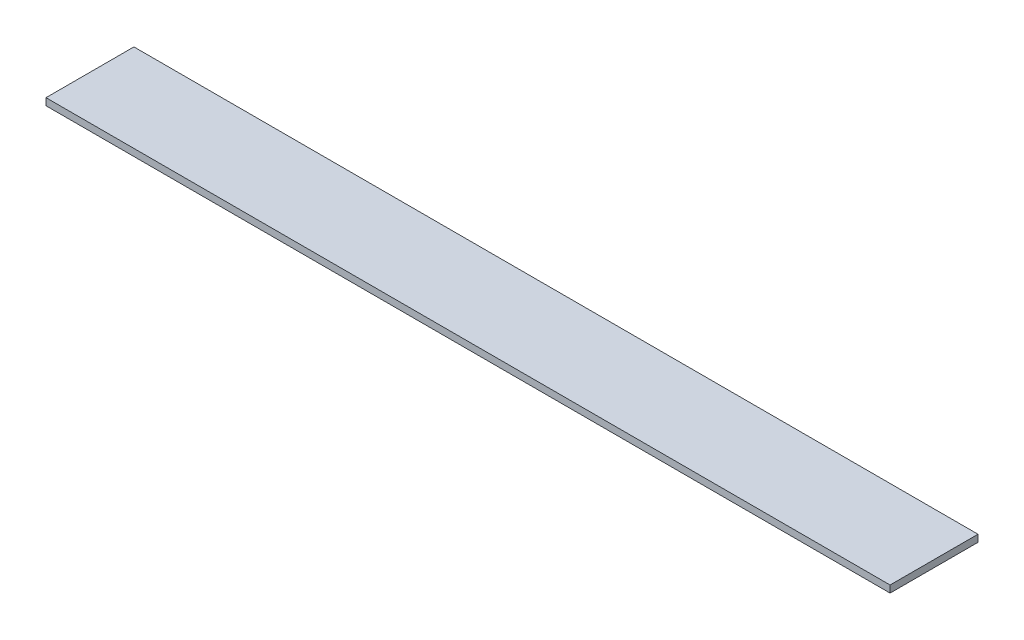
ISO-10303-21;
HEADER;
FILE_DESCRIPTION(('STEP AP214'),'2;1');
FILE_NAME('part.step','',(''),(''),'','','');
FILE_SCHEMA(('AUTOMOTIVE_DESIGN { 1 0 10303 214 1 1 1 1 }'));
ENDSEC;
DATA;
#1=APPLICATION_CONTEXT('core data for automotive mechanical design processes');
#2=APPLICATION_PROTOCOL_DEFINITION('international standard','automotive_design',2000,#1);
#3=PRODUCT_CONTEXT('',#1,'mechanical');
#4=PRODUCT('Part','Part','',(#3));
#5=PRODUCT_RELATED_PRODUCT_CATEGORY('part','',(#4));
#6=PRODUCT_DEFINITION_FORMATION('','',#4);
#7=PRODUCT_DEFINITION_CONTEXT('part definition',#1,'design');
#8=PRODUCT_DEFINITION('design','',#6,#7);
#9=PRODUCT_DEFINITION_SHAPE('','',#8);
#10=(LENGTH_UNIT() NAMED_UNIT(*) SI_UNIT(.MILLI.,.METRE.));
#11=(NAMED_UNIT(*) PLANE_ANGLE_UNIT() SI_UNIT($,.RADIAN.));
#12=(NAMED_UNIT(*) SI_UNIT($,.STERADIAN.) SOLID_ANGLE_UNIT());
#13=UNCERTAINTY_MEASURE_WITH_UNIT(LENGTH_MEASURE(1.E-05),#10,'distance_accuracy_value','');
#14=(GEOMETRIC_REPRESENTATION_CONTEXT(3) GLOBAL_UNCERTAINTY_ASSIGNED_CONTEXT((#13)) GLOBAL_UNIT_ASSIGNED_CONTEXT((#10,
#11,#12)) REPRESENTATION_CONTEXT('',''));
#15=CARTESIAN_POINT('',(0.,0.,0.));
#16=DIRECTION('',(0.,0.,1.));
#17=DIRECTION('',(1.,0.,0.));
#18=AXIS2_PLACEMENT_3D('',#15,#16,#17);
#19=CARTESIAN_POINT('',(304.8,2.54,0.));
#20=DIRECTION('',(0.,0.,-1.));
#21=DIRECTION('',(-1.,0.,0.));
#22=AXIS2_PLACEMENT_3D('',#19,#20,#21);
#23=PLANE('',#22);
#24=DIRECTION('',(1.,0.,0.));
#25=VECTOR('',#24,1.);
#26=CARTESIAN_POINT('',(304.8,0.,0.));
#27=LINE('',#26,#25);
#28=CARTESIAN_POINT('',(0.,0.,0.));
#29=VERTEX_POINT('',#28);
#30=CARTESIAN_POINT('',(304.8,0.,0.));
#31=VERTEX_POINT('',#30);
#32=EDGE_CURVE('E96',#29,#31,#27,.T.);
#33=ORIENTED_EDGE('',*,*,#32,.T.);
#34=DIRECTION('',(0.,-1.,0.));
#35=VECTOR('',#34,1.);
#36=CARTESIAN_POINT('',(304.8,2.54,0.));
#37=LINE('',#36,#35);
#38=CARTESIAN_POINT('',(304.8,2.54,0.));
#39=VERTEX_POINT('',#38);
#40=EDGE_CURVE('E11',#39,#31,#37,.T.);
#41=ORIENTED_EDGE('',*,*,#40,.F.);
#42=DIRECTION('',(1.,0.,0.));
#43=VECTOR('',#42,1.);
#44=CARTESIAN_POINT('',(304.8,2.54,0.));
#45=LINE('',#44,#43);
#46=CARTESIAN_POINT('',(0.,2.54,0.));
#47=VERTEX_POINT('',#46);
#48=EDGE_CURVE('E84',#47,#39,#45,.T.);
#49=ORIENTED_EDGE('',*,*,#48,.F.);
#50=DIRECTION('',(0.,-1.,0.));
#51=VECTOR('',#50,1.);
#52=CARTESIAN_POINT('',(0.,2.54,0.));
#53=LINE('',#52,#51);
#54=EDGE_CURVE('E92',#47,#29,#53,.T.);
#55=ORIENTED_EDGE('',*,*,#54,.T.);
#56=EDGE_LOOP('',(#33,#41,#49,#55));
#57=FACE_BOUND('',#56,.T.);
#58=ADVANCED_FACE('F33',(#57),#23,.F.);
#59=CARTESIAN_POINT('',(304.8,2.54,-31.75));
#60=DIRECTION('',(-1.,0.,0.));
#61=DIRECTION('',(0.,0.,1.));
#62=AXIS2_PLACEMENT_3D('',#59,#60,#61);
#63=PLANE('',#62);
#64=DIRECTION('',(0.,0.,-1.));
#65=VECTOR('',#64,1.);
#66=CARTESIAN_POINT('',(304.8,0.,-31.75));
#67=LINE('',#66,#65);
#68=CARTESIAN_POINT('',(304.8,0.,-31.75));
#69=VERTEX_POINT('',#68);
#70=EDGE_CURVE('E88',#31,#69,#67,.T.);
#71=ORIENTED_EDGE('',*,*,#70,.T.);
#72=DIRECTION('',(0.,-1.,0.));
#73=VECTOR('',#72,1.);
#74=CARTESIAN_POINT('',(304.8,2.54,-31.75));
#75=LINE('',#74,#73);
#76=CARTESIAN_POINT('',(304.8,2.54,-31.75));
#77=VERTEX_POINT('',#76);
#78=EDGE_CURVE('E41',#77,#69,#75,.T.);
#79=ORIENTED_EDGE('',*,*,#78,.F.);
#80=DIRECTION('',(0.,0.,-1.));
#81=VECTOR('',#80,1.);
#82=CARTESIAN_POINT('',(304.8,2.54,-31.75));
#83=LINE('',#82,#81);
#84=EDGE_CURVE('E79',#39,#77,#83,.T.);
#85=ORIENTED_EDGE('',*,*,#84,.F.);
#86=ORIENTED_EDGE('',*,*,#40,.T.);
#87=EDGE_LOOP('',(#71,#79,#85,#86));
#88=FACE_BOUND('',#87,.T.);
#89=ADVANCED_FACE('F87',(#88),#63,.F.);
#90=CARTESIAN_POINT('',(0.,2.54,-31.75));
#91=DIRECTION('',(0.,0.,1.));
#92=DIRECTION('',(1.,0.,0.));
#93=AXIS2_PLACEMENT_3D('',#90,#91,#92);
#94=PLANE('',#93);
#95=DIRECTION('',(-1.,0.,0.));
#96=VECTOR('',#95,1.);
#97=CARTESIAN_POINT('',(0.,0.,-31.75));
#98=LINE('',#97,#96);
#99=CARTESIAN_POINT('',(0.,0.,-31.75));
#100=VERTEX_POINT('',#99);
#101=EDGE_CURVE('E66',#69,#100,#98,.T.);
#102=ORIENTED_EDGE('',*,*,#101,.T.);
#103=DIRECTION('',(0.,-1.,0.));
#104=VECTOR('',#103,1.);
#105=CARTESIAN_POINT('',(0.,2.54,-31.75));
#106=LINE('',#105,#104);
#107=CARTESIAN_POINT('',(0.,2.54,-31.75));
#108=VERTEX_POINT('',#107);
#109=EDGE_CURVE('E89',#108,#100,#106,.T.);
#110=ORIENTED_EDGE('',*,*,#109,.F.);
#111=DIRECTION('',(-1.,0.,0.));
#112=VECTOR('',#111,1.);
#113=CARTESIAN_POINT('',(0.,2.54,-31.75));
#114=LINE('',#113,#112);
#115=EDGE_CURVE('E82',#77,#108,#114,.T.);
#116=ORIENTED_EDGE('',*,*,#115,.F.);
#117=ORIENTED_EDGE('',*,*,#78,.T.);
#118=EDGE_LOOP('',(#102,#110,#116,#117));
#119=FACE_BOUND('',#118,.T.);
#120=ADVANCED_FACE('F90',(#119),#94,.F.);
#121=CARTESIAN_POINT('',(0.,2.54,0.));
#122=DIRECTION('',(1.,0.,0.));
#123=DIRECTION('',(0.,0.,-1.));
#124=AXIS2_PLACEMENT_3D('',#121,#122,#123);
#125=PLANE('',#124);
#126=DIRECTION('',(0.,0.,1.));
#127=VECTOR('',#126,1.);
#128=CARTESIAN_POINT('',(0.,0.,0.));
#129=LINE('',#128,#127);
#130=EDGE_CURVE('E72',#100,#29,#129,.T.);
#131=ORIENTED_EDGE('',*,*,#130,.T.);
#132=ORIENTED_EDGE('',*,*,#54,.F.);
#133=DIRECTION('',(0.,0.,1.));
#134=VECTOR('',#133,1.);
#135=CARTESIAN_POINT('',(0.,2.54,0.));
#136=LINE('',#135,#134);
#137=EDGE_CURVE('E49',#108,#47,#136,.T.);
#138=ORIENTED_EDGE('',*,*,#137,.F.);
#139=ORIENTED_EDGE('',*,*,#109,.T.);
#140=EDGE_LOOP('',(#131,#132,#138,#139));
#141=FACE_BOUND('',#140,.T.);
#142=ADVANCED_FACE('F103',(#141),#125,.F.);
#143=CARTESIAN_POINT('',(0.,2.54,0.));
#144=DIRECTION('',(0.,-1.,0.));
#145=DIRECTION('',(0.,0.,-1.));
#146=AXIS2_PLACEMENT_3D('',#143,#144,#145);
#147=PLANE('',#146);
#148=ORIENTED_EDGE('',*,*,#48,.T.);
#149=ORIENTED_EDGE('',*,*,#84,.T.);
#150=ORIENTED_EDGE('',*,*,#115,.T.);
#151=ORIENTED_EDGE('',*,*,#137,.T.);
#152=EDGE_LOOP('',(#148,#149,#150,#151));
#153=FACE_BOUND('',#152,.T.);
#154=ADVANCED_FACE('F80',(#153),#147,.F.);
#155=CARTESIAN_POINT('',(0.,0.,0.));
#156=DIRECTION('',(0.,-1.,0.));
#157=DIRECTION('',(0.,0.,-1.));
#158=AXIS2_PLACEMENT_3D('',#155,#156,#157);
#159=PLANE('',#158);
#160=ORIENTED_EDGE('',*,*,#32,.F.);
#161=ORIENTED_EDGE('',*,*,#130,.F.);
#162=ORIENTED_EDGE('',*,*,#101,.F.);
#163=ORIENTED_EDGE('',*,*,#70,.F.);
#164=EDGE_LOOP('',(#160,#161,#162,#163));
#165=FACE_BOUND('',#164,.T.);
#166=ADVANCED_FACE('F106',(#165),#159,.T.);
#167=CLOSED_SHELL('',(#58,#89,#120,#142,#154,#166));
#168=MANIFOLD_SOLID_BREP('B2',#167);
#169=ADVANCED_BREP_SHAPE_REPRESENTATION('',(#18,#168),#14);
#170=SHAPE_DEFINITION_REPRESENTATION(#9,#169);
ENDSEC;
END-ISO-10303-21;
